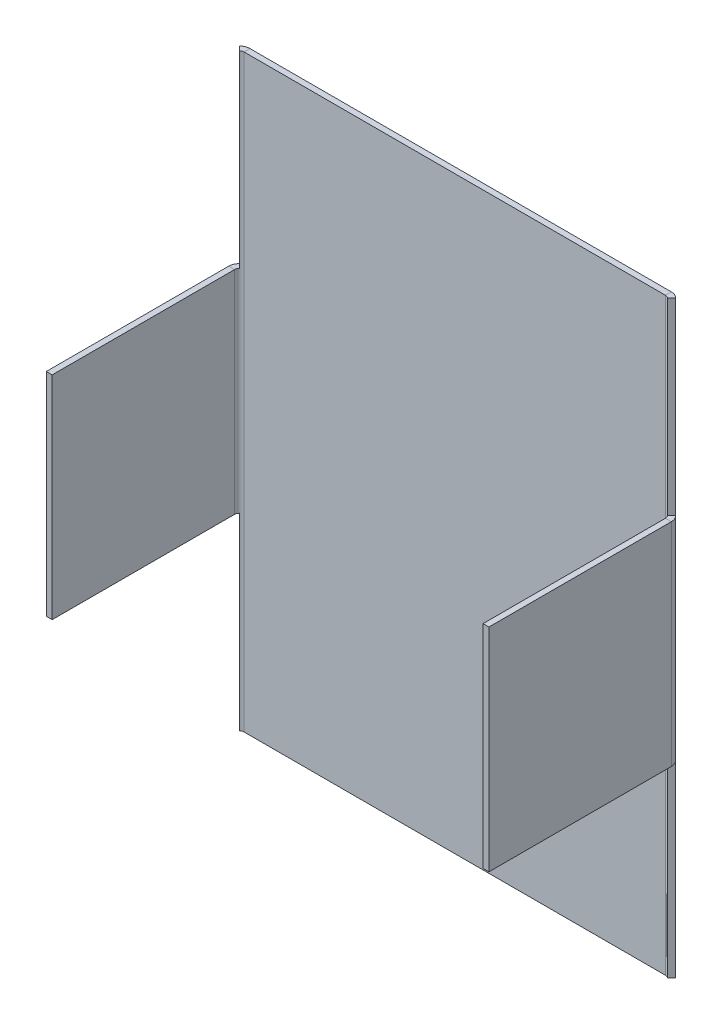
ISO-10303-21;
HEADER;
FILE_DESCRIPTION(('STEP AP214'),'2;1');
FILE_NAME('part.step','',(''),(''),'','','');
FILE_SCHEMA(('AUTOMOTIVE_DESIGN { 1 0 10303 214 1 1 1 1 }'));
ENDSEC;
DATA;
#1=APPLICATION_CONTEXT('core data for automotive mechanical design processes');
#2=APPLICATION_PROTOCOL_DEFINITION('international standard','automotive_design',2000,#1);
#3=PRODUCT_CONTEXT('',#1,'mechanical');
#4=PRODUCT('Part','Part','',(#3));
#5=PRODUCT_RELATED_PRODUCT_CATEGORY('part','',(#4));
#6=PRODUCT_DEFINITION_FORMATION('','',#4);
#7=PRODUCT_DEFINITION_CONTEXT('part definition',#1,'design');
#8=PRODUCT_DEFINITION('design','',#6,#7);
#9=PRODUCT_DEFINITION_SHAPE('','',#8);
#10=(LENGTH_UNIT() NAMED_UNIT(*) SI_UNIT(.MILLI.,.METRE.));
#11=(NAMED_UNIT(*) PLANE_ANGLE_UNIT() SI_UNIT($,.RADIAN.));
#12=(NAMED_UNIT(*) SI_UNIT($,.STERADIAN.) SOLID_ANGLE_UNIT());
#13=UNCERTAINTY_MEASURE_WITH_UNIT(LENGTH_MEASURE(1.E-05),#10,'distance_accuracy_value','');
#14=(GEOMETRIC_REPRESENTATION_CONTEXT(3) GLOBAL_UNCERTAINTY_ASSIGNED_CONTEXT((#13)) GLOBAL_UNIT_ASSIGNED_CONTEXT((#10,
#11,#12)) REPRESENTATION_CONTEXT('',''));
#15=CARTESIAN_POINT('',(0.,0.,0.));
#16=DIRECTION('',(0.,0.,1.));
#17=DIRECTION('',(1.,0.,0.));
#18=AXIS2_PLACEMENT_3D('',#15,#16,#17);
#19=CARTESIAN_POINT('',(-378.43533500819,-76.8636295973799,-3.175));
#20=DIRECTION('',(0.,-1.,0.));
#21=DIRECTION('',(0.,0.,-1.));
#22=AXIS2_PLACEMENT_3D('',#19,#20,#21);
#23=PLANE('',#22);
#24=DIRECTION('',(1.,0.,0.));
#25=VECTOR('',#24,1.);
#26=CARTESIAN_POINT('',(-378.43533500819,-76.8636295973799,-3.175));
#27=LINE('',#26,#25);
#28=CARTESIAN_POINT('',(-375.193604088767,-76.8636295973799,-3.175));
#29=VERTEX_POINT('',#28);
#30=CARTESIAN_POINT('',(-147.997065927613,-76.8636295973797,-3.175));
#31=VERTEX_POINT('',#30);
#32=EDGE_CURVE('E389',#29,#31,#27,.T.);
#33=ORIENTED_EDGE('',*,*,#32,.T.);
#34=DIRECTION('',(0.,0.,1.));
#35=VECTOR('',#34,1.);
#36=CARTESIAN_POINT('',(-147.997065927613,-76.8636295973799,-3.175));
#37=LINE('',#36,#35);
#38=CARTESIAN_POINT('',(-147.997065927613,-76.8636295973799,0.));
#39=VERTEX_POINT('',#38);
#40=EDGE_CURVE('E12',#31,#39,#37,.T.);
#41=ORIENTED_EDGE('',*,*,#40,.T.);
#42=DIRECTION('',(1.,0.,0.));
#43=VECTOR('',#42,1.);
#44=CARTESIAN_POINT('',(-378.43533500819,-76.8636295973799,0.));
#45=LINE('',#44,#43);
#46=CARTESIAN_POINT('',(-375.193604088767,-76.8636295973799,0.));
#47=VERTEX_POINT('',#46);
#48=EDGE_CURVE('E365',#47,#39,#45,.T.);
#49=ORIENTED_EDGE('',*,*,#48,.F.);
#50=DIRECTION('',(0.,0.,1.));
#51=VECTOR('',#50,1.);
#52=CARTESIAN_POINT('',(-375.193604088767,-76.8636295973799,-3.175));
#53=LINE('',#52,#51);
#54=EDGE_CURVE('E371',#29,#47,#53,.T.);
#55=ORIENTED_EDGE('',*,*,#54,.F.);
#56=EDGE_LOOP('',(#33,#41,#49,#55));
#57=FACE_BOUND('',#56,.T.);
#58=ADVANCED_FACE('F52',(#57),#23,.T.);
#59=CARTESIAN_POINT('',(-144.75533500819,240.63637040262,-3.175));
#60=DIRECTION('',(0.,1.,0.));
#61=DIRECTION('',(-1.,0.,0.));
#62=AXIS2_PLACEMENT_3D('',#59,#60,#61);
#63=PLANE('',#62);
#64=DIRECTION('',(-1.,0.,0.));
#65=VECTOR('',#64,1.);
#66=CARTESIAN_POINT('',(-144.75533500819,240.63637040262,0.));
#67=LINE('',#66,#65);
#68=CARTESIAN_POINT('',(-147.997065927613,240.63637040262,0.));
#69=VERTEX_POINT('',#68);
#70=CARTESIAN_POINT('',(-375.193604088767,240.63637040262,0.));
#71=VERTEX_POINT('',#70);
#72=EDGE_CURVE('E56',#69,#71,#67,.T.);
#73=ORIENTED_EDGE('',*,*,#72,.F.);
#74=DIRECTION('',(0.,0.,-1.));
#75=VECTOR('',#74,1.);
#76=CARTESIAN_POINT('',(-147.997065927613,240.63637040262,-3.175));
#77=LINE('',#76,#75);
#78=CARTESIAN_POINT('',(-147.997065927613,240.63637040262,-3.175));
#79=VERTEX_POINT('',#78);
#80=EDGE_CURVE('E385',#69,#79,#77,.T.);
#81=ORIENTED_EDGE('',*,*,#80,.T.);
#82=DIRECTION('',(-1.,0.,0.));
#83=VECTOR('',#82,1.);
#84=CARTESIAN_POINT('',(-144.75533500819,240.63637040262,-3.175));
#85=LINE('',#84,#83);
#86=CARTESIAN_POINT('',(-375.193604088767,240.63637040262,-3.175));
#87=VERTEX_POINT('',#86);
#88=EDGE_CURVE('E372',#79,#87,#85,.T.);
#89=ORIENTED_EDGE('',*,*,#88,.T.);
#90=DIRECTION('',(0.,0.,-1.));
#91=VECTOR('',#90,1.);
#92=CARTESIAN_POINT('',(-375.193604088767,240.63637040262,-3.175));
#93=LINE('',#92,#91);
#94=EDGE_CURVE('E379',#71,#87,#93,.T.);
#95=ORIENTED_EDGE('',*,*,#94,.F.);
#96=EDGE_LOOP('',(#73,#81,#89,#95));
#97=FACE_BOUND('',#96,.T.);
#98=ADVANCED_FACE('F490',(#97),#63,.T.);
#99=CARTESIAN_POINT('',(0.,0.,-3.175));
#100=DIRECTION('',(0.,0.,-1.));
#101=DIRECTION('',(-1.,0.,0.));
#102=AXIS2_PLACEMENT_3D('',#99,#100,#101);
#103=PLANE('',#102);
#104=ORIENTED_EDGE('',*,*,#88,.F.);
#105=DIRECTION('',(0.,-1.,0.));
#106=VECTOR('',#105,1.);
#107=CARTESIAN_POINT('',(-147.997065927613,0.,-3.175));
#108=LINE('',#107,#106);
#109=EDGE_CURVE('E382',#79,#31,#108,.T.);
#110=ORIENTED_EDGE('',*,*,#109,.T.);
#111=ORIENTED_EDGE('',*,*,#32,.F.);
#112=DIRECTION('',(0.,-1.,0.));
#113=VECTOR('',#112,1.);
#114=CARTESIAN_POINT('',(-375.193604088767,-1.96794603756588E-13,-3.175));
#115=LINE('',#114,#113);
#116=EDGE_CURVE('E367',#87,#29,#115,.T.);
#117=ORIENTED_EDGE('',*,*,#116,.F.);
#118=EDGE_LOOP('',(#104,#110,#111,#117));
#119=FACE_BOUND('',#118,.T.);
#120=ADVANCED_FACE('F450',(#119),#103,.T.);
#121=CARTESIAN_POINT('',(0.,0.,0.));
#122=DIRECTION('',(0.,0.,-1.));
#123=DIRECTION('',(-1.,0.,0.));
#124=AXIS2_PLACEMENT_3D('',#121,#122,#123);
#125=PLANE('',#124);
#126=DIRECTION('',(0.,-1.,0.));
#127=VECTOR('',#126,1.);
#128=CARTESIAN_POINT('',(-147.997065927613,0.,0.));
#129=LINE('',#128,#127);
#130=EDGE_CURVE('E61',#69,#39,#129,.T.);
#131=ORIENTED_EDGE('',*,*,#130,.F.);
#132=ORIENTED_EDGE('',*,*,#72,.T.);
#133=DIRECTION('',(0.,-1.,0.));
#134=VECTOR('',#133,1.);
#135=CARTESIAN_POINT('',(-375.193604088767,-1.96794603756588E-13,0.));
#136=LINE('',#135,#134);
#137=EDGE_CURVE('E376',#71,#47,#136,.T.);
#138=ORIENTED_EDGE('',*,*,#137,.T.);
#139=ORIENTED_EDGE('',*,*,#48,.T.);
#140=EDGE_LOOP('',(#131,#132,#138,#139));
#141=FACE_BOUND('',#140,.T.);
#142=ADVANCED_FACE('F54',(#141),#125,.F.);
#143=CARTESIAN_POINT('',(-375.193604088767,139.03637040262,2.54));
#144=DIRECTION('',(0.,1.,0.));
#145=DIRECTION('',(0.,0.,1.));
#146=AXIS2_PLACEMENT_3D('',#143,#144,#145);
#147=PLANE('',#146);
#148=DIRECTION('',(-1.,0.,0.));
#149=VECTOR('',#148,1.);
#150=CARTESIAN_POINT('',(-380.908604088767,139.03637040262,2.54000000000004));
#151=LINE('',#150,#149);
#152=CARTESIAN_POINT('',(-377.733604088767,139.03637040262,2.54000000000004));
#153=VERTEX_POINT('',#152);
#154=CARTESIAN_POINT('',(-380.908604088767,139.03637040262,2.54000000000011));
#155=VERTEX_POINT('',#154);
#156=EDGE_CURVE('E286',#153,#155,#151,.T.);
#157=ORIENTED_EDGE('',*,*,#156,.F.);
#158=CARTESIAN_POINT('',(-375.193604088767,139.03637040262,2.54));
#159=DIRECTION('',(0.,1.,0.));
#160=DIRECTION('',(-1.,0.,0.));
#161=AXIS2_PLACEMENT_3D('',#158,#159,#160);
#162=CIRCLE('',#161,2.54);
#163=CARTESIAN_POINT('',(-376.989655312981,139.03637040262,0.743948775786153));
#164=VERTEX_POINT('',#163);
#165=EDGE_CURVE('E282',#153,#164,#162,.F.);
#166=ORIENTED_EDGE('',*,*,#165,.T.);
#167=DIRECTION('',(-0.707106781186552,0.,-0.707106781186543));
#168=VECTOR('',#167,1.);
#169=CARTESIAN_POINT('',(-379.234719343249,139.03637040262,-1.50111525448112));
#170=LINE('',#169,#168);
#171=CARTESIAN_POINT('',(-379.234719343249,139.03637040262,-1.50111525448112));
#172=VERTEX_POINT('',#171);
#173=EDGE_CURVE('E363',#164,#172,#170,.T.);
#174=ORIENTED_EDGE('',*,*,#173,.T.);
#175=CARTESIAN_POINT('',(-375.193604088767,139.03637040262,2.54));
#176=DIRECTION('',(0.,-1.,0.));
#177=DIRECTION('',(0.,0.,1.));
#178=AXIS2_PLACEMENT_3D('',#175,#176,#177);
#179=CIRCLE('',#178,5.71500000000001);
#180=EDGE_CURVE('E316',#155,#172,#179,.T.);
#181=ORIENTED_EDGE('',*,*,#180,.F.);
#182=EDGE_LOOP('',(#157,#166,#174,#181));
#183=FACE_BOUND('',#182,.T.);
#184=ADVANCED_FACE('F482',(#183),#147,.T.);
#185=CARTESIAN_POINT('',(-379.234719343248,189.83637040262,-1.50111525448116));
#186=DIRECTION('',(-0.707106781186554,0.,0.707106781186541));
#187=DIRECTION('',(0.,1.,0.));
#188=AXIS2_PLACEMENT_3D('',#185,#186,#187);
#189=PLANE('',#188);
#190=ORIENTED_EDGE('',*,*,#173,.F.);
#191=DIRECTION('',(0.,1.,0.));
#192=VECTOR('',#191,1.);
#193=CARTESIAN_POINT('',(-376.989655312981,-235.695691279736,0.743948775786153));
#194=LINE('',#193,#192);
#195=CARTESIAN_POINT('',(-376.989655312981,240.63637040262,0.743948775786153));
#196=VERTEX_POINT('',#195);
#197=EDGE_CURVE('E350',#164,#196,#194,.T.);
#198=ORIENTED_EDGE('',*,*,#197,.T.);
#199=DIRECTION('',(-0.707106781186534,0.,-0.707106781186561));
#200=VECTOR('',#199,1.);
#201=CARTESIAN_POINT('',(-379.234719343248,240.63637040262,-1.50111525448121));
#202=LINE('',#201,#200);
#203=CARTESIAN_POINT('',(-379.234719343248,240.63637040262,-1.50111525448121));
#204=VERTEX_POINT('',#203);
#205=EDGE_CURVE('E361',#196,#204,#202,.T.);
#206=ORIENTED_EDGE('',*,*,#205,.T.);
#207=DIRECTION('',(0.,1.,0.));
#208=VECTOR('',#207,1.);
#209=CARTESIAN_POINT('',(-379.234719343248,240.63637040262,-1.50111525448121));
#210=LINE('',#209,#208);
#211=EDGE_CURVE('E319',#172,#204,#210,.T.);
#212=ORIENTED_EDGE('',*,*,#211,.F.);
#213=EDGE_LOOP('',(#190,#198,#206,#212));
#214=FACE_BOUND('',#213,.T.);
#215=ADVANCED_FACE('F485',(#214),#189,.T.);
#216=CARTESIAN_POINT('',(-375.193604088767,240.63637040262,2.54));
#217=DIRECTION('',(0.,1.,0.));
#218=DIRECTION('',(0.,0.,1.));
#219=AXIS2_PLACEMENT_3D('',#216,#217,#218);
#220=PLANE('',#219);
#221=ORIENTED_EDGE('',*,*,#205,.F.);
#222=CARTESIAN_POINT('',(-375.193604088767,240.63637040262,2.54));
#223=DIRECTION('',(0.,1.,0.));
#224=DIRECTION('',(-1.,0.,0.));
#225=AXIS2_PLACEMENT_3D('',#222,#223,#224);
#226=CIRCLE('',#225,2.54);
#227=EDGE_CURVE('E347',#196,#71,#226,.F.);
#228=ORIENTED_EDGE('',*,*,#227,.T.);
#229=ORIENTED_EDGE('',*,*,#94,.T.);
#230=CARTESIAN_POINT('',(-375.193604088767,240.63637040262,2.54));
#231=DIRECTION('',(0.,-1.,0.));
#232=DIRECTION('',(0.,0.,1.));
#233=AXIS2_PLACEMENT_3D('',#230,#231,#232);
#234=CIRCLE('',#233,5.715);
#235=EDGE_CURVE('E324',#204,#87,#234,.T.);
#236=ORIENTED_EDGE('',*,*,#235,.F.);
#237=EDGE_LOOP('',(#221,#228,#229,#236));
#238=FACE_BOUND('',#237,.T.);
#239=ADVANCED_FACE('F488',(#238),#220,.T.);
#240=CARTESIAN_POINT('',(-375.193604088767,-76.8636295973799,2.54));
#241=DIRECTION('',(0.,-1.,0.));
#242=DIRECTION('',(0.,0.,-1.));
#243=AXIS2_PLACEMENT_3D('',#240,#241,#242);
#244=PLANE('',#243);
#245=ORIENTED_EDGE('',*,*,#54,.T.);
#246=CARTESIAN_POINT('',(-375.193604088767,-76.8636295973798,2.54));
#247=DIRECTION('',(0.,1.,0.));
#248=DIRECTION('',(-1.,0.,0.));
#249=AXIS2_PLACEMENT_3D('',#246,#247,#248);
#250=CIRCLE('',#249,2.54);
#251=CARTESIAN_POINT('',(-376.989655312981,-76.8636295973798,0.743948775786182));
#252=VERTEX_POINT('',#251);
#253=EDGE_CURVE('E343',#47,#252,#250,.T.);
#254=ORIENTED_EDGE('',*,*,#253,.T.);
#255=DIRECTION('',(-0.707106781186556,0.,-0.707106781186539));
#256=VECTOR('',#255,1.);
#257=CARTESIAN_POINT('',(-379.234719343248,-76.8636295973799,-1.50111525448107));
#258=LINE('',#257,#256);
#259=CARTESIAN_POINT('',(-379.234719343248,-76.8636295973799,-1.50111525448107));
#260=VERTEX_POINT('',#259);
#261=EDGE_CURVE('E358',#252,#260,#258,.T.);
#262=ORIENTED_EDGE('',*,*,#261,.T.);
#263=CARTESIAN_POINT('',(-375.193604088767,-76.8636295973799,2.54));
#264=DIRECTION('',(0.,1.,0.));
#265=DIRECTION('',(0.,0.,-1.));
#266=AXIS2_PLACEMENT_3D('',#263,#264,#265);
#267=CIRCLE('',#266,5.71500000000002);
#268=EDGE_CURVE('E327',#29,#260,#267,.T.);
#269=ORIENTED_EDGE('',*,*,#268,.F.);
#270=EDGE_LOOP('',(#245,#254,#262,#269));
#271=FACE_BOUND('',#270,.T.);
#272=ADVANCED_FACE('F460',(#271),#244,.T.);
#273=CARTESIAN_POINT('',(-379.234719343248,-26.0636295973799,-1.50111525448109));
#274=DIRECTION('',(-0.707106781186543,0.,0.707106781186552));
#275=DIRECTION('',(0.,1.,0.));
#276=AXIS2_PLACEMENT_3D('',#273,#274,#275);
#277=PLANE('',#276);
#278=ORIENTED_EDGE('',*,*,#261,.F.);
#279=DIRECTION('',(0.,1.,0.));
#280=VECTOR('',#279,1.);
#281=CARTESIAN_POINT('',(-376.989655312981,-235.695691279736,0.743948775786182));
#282=LINE('',#281,#280);
#283=CARTESIAN_POINT('',(-376.989655312981,24.7363704026201,0.743948775786182));
#284=VERTEX_POINT('',#283);
#285=EDGE_CURVE('E339',#252,#284,#282,.T.);
#286=ORIENTED_EDGE('',*,*,#285,.T.);
#287=DIRECTION('',(-0.707106781186551,0.,-0.707106781186544));
#288=VECTOR('',#287,1.);
#289=CARTESIAN_POINT('',(-379.234719343248,24.7363704026201,-1.50111525448107));
#290=LINE('',#289,#288);
#291=CARTESIAN_POINT('',(-379.234719343248,24.7363704026201,-1.50111525448107));
#292=VERTEX_POINT('',#291);
#293=EDGE_CURVE('E338',#284,#292,#290,.T.);
#294=ORIENTED_EDGE('',*,*,#293,.T.);
#295=DIRECTION('',(0.,1.,0.));
#296=VECTOR('',#295,1.);
#297=CARTESIAN_POINT('',(-379.234719343248,24.7363704026201,-1.50111525448107));
#298=LINE('',#297,#296);
#299=EDGE_CURVE('E331',#260,#292,#298,.T.);
#300=ORIENTED_EDGE('',*,*,#299,.F.);
#301=EDGE_LOOP('',(#278,#286,#294,#300));
#302=FACE_BOUND('',#301,.T.);
#303=ADVANCED_FACE('F463',(#302),#277,.T.);
#304=CARTESIAN_POINT('',(-375.193604088767,24.7363704026201,2.54));
#305=DIRECTION('',(0.,-1.,0.));
#306=DIRECTION('',(1.,0.,0.));
#307=AXIS2_PLACEMENT_3D('',#304,#305,#306);
#308=PLANE('',#307);
#309=CARTESIAN_POINT('',(-375.193604088767,24.7363704026201,2.54));
#310=DIRECTION('',(0.,1.,0.));
#311=DIRECTION('',(-1.,0.,0.));
#312=AXIS2_PLACEMENT_3D('',#309,#310,#311);
#313=CIRCLE('',#312,2.54);
#314=CARTESIAN_POINT('',(-377.733604088767,24.7363704026201,2.5400000000001));
#315=VERTEX_POINT('',#314);
#316=EDGE_CURVE('E320',#284,#315,#313,.T.);
#317=ORIENTED_EDGE('',*,*,#316,.T.);
#318=DIRECTION('',(1.,0.,0.));
#319=VECTOR('',#318,1.);
#320=CARTESIAN_POINT('',(-380.908604088767,24.7363704026201,2.54000000000004));
#321=LINE('',#320,#319);
#322=CARTESIAN_POINT('',(-380.908604088767,24.7363704026201,2.54000000000004));
#323=VERTEX_POINT('',#322);
#324=EDGE_CURVE('E298',#323,#315,#321,.T.);
#325=ORIENTED_EDGE('',*,*,#324,.F.);
#326=CARTESIAN_POINT('',(-375.193604088767,24.7363704026201,2.54));
#327=DIRECTION('',(0.,1.,0.));
#328=DIRECTION('',(1.,0.,0.));
#329=AXIS2_PLACEMENT_3D('',#326,#327,#328);
#330=CIRCLE('',#329,5.71500000000001);
#331=EDGE_CURVE('E335',#292,#323,#330,.T.);
#332=ORIENTED_EDGE('',*,*,#331,.F.);
#333=ORIENTED_EDGE('',*,*,#293,.F.);
#334=EDGE_LOOP('',(#317,#325,#332,#333));
#335=FACE_BOUND('',#334,.T.);
#336=ADVANCED_FACE('F472',(#335),#308,.T.);
#337=CARTESIAN_POINT('',(-375.193604088767,-235.695691279736,2.54));
#338=DIRECTION('',(0.,1.,0.));
#339=DIRECTION('',(-1.,0.,0.));
#340=AXIS2_PLACEMENT_3D('',#337,#338,#339);
#341=CYLINDRICAL_SURFACE('',#340,5.715);
#342=ORIENTED_EDGE('',*,*,#299,.T.);
#343=ORIENTED_EDGE('',*,*,#331,.T.);
#344=DIRECTION('',(0.,-1.,0.));
#345=VECTOR('',#344,1.);
#346=CARTESIAN_POINT('',(-380.908604088767,-1.81125084176551E-13,2.54000000000004));
#347=LINE('',#346,#345);
#348=EDGE_CURVE('E305',#155,#323,#347,.T.);
#349=ORIENTED_EDGE('',*,*,#348,.F.);
#350=ORIENTED_EDGE('',*,*,#180,.T.);
#351=ORIENTED_EDGE('',*,*,#211,.T.);
#352=ORIENTED_EDGE('',*,*,#235,.T.);
#353=ORIENTED_EDGE('',*,*,#116,.T.);
#354=ORIENTED_EDGE('',*,*,#268,.T.);
#355=EDGE_LOOP('',(#342,#343,#349,#350,#351,#352,#353,#354));
#356=FACE_BOUND('',#355,.T.);
#357=ADVANCED_FACE('F457',(#356),#341,.T.);
#358=CARTESIAN_POINT('',(-375.193604088767,-235.695691279736,2.54));
#359=DIRECTION('',(0.,1.,0.));
#360=DIRECTION('',(-1.,0.,0.));
#361=AXIS2_PLACEMENT_3D('',#358,#359,#360);
#362=CYLINDRICAL_SURFACE('',#361,2.54);
#363=ORIENTED_EDGE('',*,*,#285,.F.);
#364=ORIENTED_EDGE('',*,*,#253,.F.);
#365=ORIENTED_EDGE('',*,*,#137,.F.);
#366=ORIENTED_EDGE('',*,*,#227,.F.);
#367=ORIENTED_EDGE('',*,*,#197,.F.);
#368=ORIENTED_EDGE('',*,*,#165,.F.);
#369=DIRECTION('',(0.,-1.,0.));
#370=VECTOR('',#369,1.);
#371=CARTESIAN_POINT('',(-377.733604088767,-1.79459749639613E-13,2.54000000000004));
#372=LINE('',#371,#370);
#373=EDGE_CURVE('E277',#153,#315,#372,.T.);
#374=ORIENTED_EDGE('',*,*,#373,.T.);
#375=ORIENTED_EDGE('',*,*,#316,.F.);
#376=EDGE_LOOP('',(#363,#364,#365,#366,#367,#368,#374,#375));
#377=FACE_BOUND('',#376,.T.);
#378=ADVANCED_FACE('F466',(#377),#362,.F.);
#379=CARTESIAN_POINT('',(-380.908604088767,139.03637040262,100.898269080577));
#380=DIRECTION('',(0.,0.,1.));
#381=DIRECTION('',(1.,0.,0.));
#382=AXIS2_PLACEMENT_3D('',#379,#380,#381);
#383=PLANE('',#382);
#384=DIRECTION('',(0.,-1.,0.));
#385=VECTOR('',#384,1.);
#386=CARTESIAN_POINT('',(-377.733604088767,139.03637040262,100.898269080577));
#387=LINE('',#386,#385);
#388=CARTESIAN_POINT('',(-377.733604088767,139.03637040262,100.898269080577));
#389=VERTEX_POINT('',#388);
#390=CARTESIAN_POINT('',(-377.733604088767,24.7363704026201,100.898269080577));
#391=VERTEX_POINT('',#390);
#392=EDGE_CURVE('E291',#389,#391,#387,.T.);
#393=ORIENTED_EDGE('',*,*,#392,.F.);
#394=DIRECTION('',(1.,0.,0.));
#395=VECTOR('',#394,1.);
#396=CARTESIAN_POINT('',(-380.908604088767,139.03637040262,100.898269080577));
#397=LINE('',#396,#395);
#398=CARTESIAN_POINT('',(-380.908604088767,139.03637040262,100.898269080577));
#399=VERTEX_POINT('',#398);
#400=EDGE_CURVE('E279',#399,#389,#397,.T.);
#401=ORIENTED_EDGE('',*,*,#400,.F.);
#402=DIRECTION('',(0.,-1.,0.));
#403=VECTOR('',#402,1.);
#404=CARTESIAN_POINT('',(-380.908604088767,139.03637040262,100.898269080577));
#405=LINE('',#404,#403);
#406=CARTESIAN_POINT('',(-380.908604088767,24.7363704026201,100.898269080577));
#407=VERTEX_POINT('',#406);
#408=EDGE_CURVE('E310',#399,#407,#405,.T.);
#409=ORIENTED_EDGE('',*,*,#408,.T.);
#410=DIRECTION('',(1.,0.,0.));
#411=VECTOR('',#410,1.);
#412=CARTESIAN_POINT('',(-380.908604088767,24.7363704026201,100.898269080577));
#413=LINE('',#412,#411);
#414=EDGE_CURVE('E307',#407,#391,#413,.T.);
#415=ORIENTED_EDGE('',*,*,#414,.T.);
#416=EDGE_LOOP('',(#393,#401,#409,#415));
#417=FACE_BOUND('',#416,.T.);
#418=ADVANCED_FACE('F518',(#417),#383,.T.);
#419=CARTESIAN_POINT('',(-380.908604088769,-1.9595436384634E-13,-379.137065927613));
#420=DIRECTION('',(-1.,0.,0.));
#421=DIRECTION('',(0.,0.,1.));
#422=AXIS2_PLACEMENT_3D('',#419,#420,#421);
#423=PLANE('',#422);
#424=DIRECTION('',(0.,0.,1.));
#425=VECTOR('',#424,1.);
#426=CARTESIAN_POINT('',(-380.908604088767,139.03637040262,-0.701730919422938));
#427=LINE('',#426,#425);
#428=EDGE_CURVE('E283',#155,#399,#427,.T.);
#429=ORIENTED_EDGE('',*,*,#428,.F.);
#430=ORIENTED_EDGE('',*,*,#348,.T.);
#431=DIRECTION('',(0.,0.,-1.));
#432=VECTOR('',#431,1.);
#433=CARTESIAN_POINT('',(-380.908604088767,24.7363704026201,100.898269080577));
#434=LINE('',#433,#432);
#435=EDGE_CURVE('E301',#407,#323,#434,.T.);
#436=ORIENTED_EDGE('',*,*,#435,.F.);
#437=ORIENTED_EDGE('',*,*,#408,.F.);
#438=EDGE_LOOP('',(#429,#430,#436,#437));
#439=FACE_BOUND('',#438,.T.);
#440=ADVANCED_FACE('F532',(#439),#423,.T.);
#441=CARTESIAN_POINT('',(-380.908604088767,24.7363704026201,100.898269080577));
#442=DIRECTION('',(0.,-1.,0.));
#443=DIRECTION('',(0.,0.,-1.));
#444=AXIS2_PLACEMENT_3D('',#441,#442,#443);
#445=PLANE('',#444);
#446=ORIENTED_EDGE('',*,*,#435,.T.);
#447=ORIENTED_EDGE('',*,*,#324,.T.);
#448=DIRECTION('',(0.,0.,-1.));
#449=VECTOR('',#448,1.);
#450=CARTESIAN_POINT('',(-377.733604088767,24.7363704026201,100.898269080577));
#451=LINE('',#450,#449);
#452=EDGE_CURVE('E288',#391,#315,#451,.T.);
#453=ORIENTED_EDGE('',*,*,#452,.F.);
#454=ORIENTED_EDGE('',*,*,#414,.F.);
#455=EDGE_LOOP('',(#446,#447,#453,#454));
#456=FACE_BOUND('',#455,.T.);
#457=ADVANCED_FACE('F528',(#456),#445,.T.);
#458=CARTESIAN_POINT('',(-377.733604088769,-1.94289029309402E-13,-379.137065927613));
#459=DIRECTION('',(-1.,0.,0.));
#460=DIRECTION('',(0.,0.,1.));
#461=AXIS2_PLACEMENT_3D('',#458,#459,#460);
#462=PLANE('',#461);
#463=ORIENTED_EDGE('',*,*,#373,.F.);
#464=DIRECTION('',(0.,0.,1.));
#465=VECTOR('',#464,1.);
#466=CARTESIAN_POINT('',(-377.733604088767,139.03637040262,-0.701730919422938));
#467=LINE('',#466,#465);
#468=EDGE_CURVE('E295',#153,#389,#467,.T.);
#469=ORIENTED_EDGE('',*,*,#468,.T.);
#470=ORIENTED_EDGE('',*,*,#392,.T.);
#471=ORIENTED_EDGE('',*,*,#452,.T.);
#472=EDGE_LOOP('',(#463,#469,#470,#471));
#473=FACE_BOUND('',#472,.T.);
#474=ADVANCED_FACE('F524',(#473),#462,.F.);
#475=CARTESIAN_POINT('',(-380.908604088767,139.03637040262,-0.701730919422938));
#476=DIRECTION('',(0.,1.,0.));
#477=DIRECTION('',(1.,0.,0.));
#478=AXIS2_PLACEMENT_3D('',#475,#476,#477);
#479=PLANE('',#478);
#480=ORIENTED_EDGE('',*,*,#468,.F.);
#481=ORIENTED_EDGE('',*,*,#156,.T.);
#482=ORIENTED_EDGE('',*,*,#428,.T.);
#483=ORIENTED_EDGE('',*,*,#400,.T.);
#484=EDGE_LOOP('',(#480,#481,#482,#483));
#485=FACE_BOUND('',#484,.T.);
#486=ADVANCED_FACE('F521',(#485),#479,.T.);
#487=CARTESIAN_POINT('',(-147.997065927613,240.63637040262,2.54));
#488=DIRECTION('',(0.,1.,0.));
#489=DIRECTION('',(0.,0.,1.));
#490=AXIS2_PLACEMENT_3D('',#487,#488,#489);
#491=PLANE('',#490);
#492=ORIENTED_EDGE('',*,*,#80,.F.);
#493=CARTESIAN_POINT('',(-147.997065927613,240.63637040262,2.54));
#494=DIRECTION('',(0.,-1.,0.));
#495=DIRECTION('',(0.,0.,-1.));
#496=AXIS2_PLACEMENT_3D('',#493,#494,#495);
#497=CIRCLE('',#496,2.54);
#498=CARTESIAN_POINT('',(-146.201014703399,240.63637040262,0.743948775786154));
#499=VERTEX_POINT('',#498);
#500=EDGE_CURVE('E217',#69,#499,#497,.T.);
#501=ORIENTED_EDGE('',*,*,#500,.T.);
#502=DIRECTION('',(0.707106781186532,0.,-0.707106781186563));
#503=VECTOR('',#502,1.);
#504=CARTESIAN_POINT('',(-143.955950673132,240.63637040262,-1.50111525448121));
#505=LINE('',#504,#503);
#506=CARTESIAN_POINT('',(-143.955950673132,240.63637040262,-1.50111525448121));
#507=VERTEX_POINT('',#506);
#508=EDGE_CURVE('E275',#499,#507,#505,.T.);
#509=ORIENTED_EDGE('',*,*,#508,.T.);
#510=CARTESIAN_POINT('',(-147.997065927613,240.63637040262,2.54));
#511=DIRECTION('',(0.,-1.,0.));
#512=DIRECTION('',(0.,0.,1.));
#513=AXIS2_PLACEMENT_3D('',#510,#511,#512);
#514=CIRCLE('',#513,5.715);
#515=EDGE_CURVE('E237',#79,#507,#514,.T.);
#516=ORIENTED_EDGE('',*,*,#515,.F.);
#517=EDGE_LOOP('',(#492,#501,#509,#516));
#518=FACE_BOUND('',#517,.T.);
#519=ADVANCED_FACE('F492',(#518),#491,.T.);
#520=CARTESIAN_POINT('',(-143.955950673132,189.83637040262,-1.50111525448116));
#521=DIRECTION('',(0.707106781186554,0.,0.707106781186541));
#522=DIRECTION('',(0.,-1.,0.));
#523=AXIS2_PLACEMENT_3D('',#520,#521,#522);
#524=PLANE('',#523);
#525=ORIENTED_EDGE('',*,*,#508,.F.);
#526=DIRECTION('',(0.,-1.,0.));
#527=VECTOR('',#526,1.);
#528=CARTESIAN_POINT('',(-146.201014703399,399.468432084976,0.743948775786154));
#529=LINE('',#528,#527);
#530=CARTESIAN_POINT('',(-146.201014703399,139.03637040262,0.743948775786154));
#531=VERTEX_POINT('',#530);
#532=EDGE_CURVE('E265',#499,#531,#529,.T.);
#533=ORIENTED_EDGE('',*,*,#532,.T.);
#534=DIRECTION('',(0.707106781186551,0.,-0.707106781186544));
#535=VECTOR('',#534,1.);
#536=CARTESIAN_POINT('',(-143.955950673132,139.03637040262,-1.5011152544811));
#537=LINE('',#536,#535);
#538=CARTESIAN_POINT('',(-143.955950673132,139.03637040262,-1.5011152544811));
#539=VERTEX_POINT('',#538);
#540=EDGE_CURVE('E273',#531,#539,#537,.T.);
#541=ORIENTED_EDGE('',*,*,#540,.T.);
#542=DIRECTION('',(0.,-1.,0.));
#543=VECTOR('',#542,1.);
#544=CARTESIAN_POINT('',(-143.955950673132,139.03637040262,-1.5011152544811));
#545=LINE('',#544,#543);
#546=EDGE_CURVE('E240',#507,#539,#545,.T.);
#547=ORIENTED_EDGE('',*,*,#546,.F.);
#548=EDGE_LOOP('',(#525,#533,#541,#547));
#549=FACE_BOUND('',#548,.T.);
#550=ADVANCED_FACE('F433',(#549),#524,.T.);
#551=CARTESIAN_POINT('',(-147.997065927613,139.03637040262,2.54));
#552=DIRECTION('',(0.,1.,0.));
#553=DIRECTION('',(0.,0.,1.));
#554=AXIS2_PLACEMENT_3D('',#551,#552,#553);
#555=PLANE('',#554);
#556=ORIENTED_EDGE('',*,*,#540,.F.);
#557=CARTESIAN_POINT('',(-147.997065927613,139.03637040262,2.54));
#558=DIRECTION('',(0.,-1.,0.));
#559=DIRECTION('',(0.,0.,-1.));
#560=AXIS2_PLACEMENT_3D('',#557,#558,#559);
#561=CIRCLE('',#560,2.54);
#562=CARTESIAN_POINT('',(-145.457065927613,139.03637040262,2.54000000000001));
#563=VERTEX_POINT('',#562);
#564=EDGE_CURVE('E262',#531,#563,#561,.T.);
#565=ORIENTED_EDGE('',*,*,#564,.T.);
#566=DIRECTION('',(1.,0.,0.));
#567=VECTOR('',#566,1.);
#568=CARTESIAN_POINT('',(-142.282065927613,139.03637040262,2.54000000000001));
#569=LINE('',#568,#567);
#570=CARTESIAN_POINT('',(-142.282065927613,139.03637040262,2.54000000000001));
#571=VERTEX_POINT('',#570);
#572=EDGE_CURVE('E225',#563,#571,#569,.T.);
#573=ORIENTED_EDGE('',*,*,#572,.T.);
#574=CARTESIAN_POINT('',(-147.997065927613,139.03637040262,2.54));
#575=DIRECTION('',(0.,-1.,0.));
#576=DIRECTION('',(0.,0.,1.));
#577=AXIS2_PLACEMENT_3D('',#574,#575,#576);
#578=CIRCLE('',#577,5.715);
#579=EDGE_CURVE('E243',#539,#571,#578,.T.);
#580=ORIENTED_EDGE('',*,*,#579,.F.);
#581=EDGE_LOOP('',(#556,#565,#573,#580));
#582=FACE_BOUND('',#581,.T.);
#583=ADVANCED_FACE('F425',(#582),#555,.T.);
#584=CARTESIAN_POINT('',(-147.997065927613,24.7363704026201,2.54));
#585=DIRECTION('',(0.,-1.,0.));
#586=DIRECTION('',(0.,0.,-1.));
#587=AXIS2_PLACEMENT_3D('',#584,#585,#586);
#588=PLANE('',#587);
#589=DIRECTION('',(-1.,0.,0.));
#590=VECTOR('',#589,1.);
#591=CARTESIAN_POINT('',(-142.282065927613,24.7363704026201,2.54000000000001));
#592=LINE('',#591,#590);
#593=CARTESIAN_POINT('',(-142.282065927613,24.7363704026201,2.54000000000003));
#594=VERTEX_POINT('',#593);
#595=CARTESIAN_POINT('',(-145.457065927613,24.7363704026201,2.54000000000001));
#596=VERTEX_POINT('',#595);
#597=EDGE_CURVE('E206',#594,#596,#592,.T.);
#598=ORIENTED_EDGE('',*,*,#597,.T.);
#599=CARTESIAN_POINT('',(-147.997065927613,24.7363704026201,2.54));
#600=DIRECTION('',(0.,-1.,0.));
#601=DIRECTION('',(0.,0.,-1.));
#602=AXIS2_PLACEMENT_3D('',#599,#600,#601);
#603=CIRCLE('',#602,2.54);
#604=CARTESIAN_POINT('',(-146.201014703399,24.7363704026201,0.743948775786178));
#605=VERTEX_POINT('',#604);
#606=EDGE_CURVE('E259',#596,#605,#603,.F.);
#607=ORIENTED_EDGE('',*,*,#606,.T.);
#608=DIRECTION('',(0.707106781186551,0.,-0.707106781186543));
#609=VECTOR('',#608,1.);
#610=CARTESIAN_POINT('',(-143.955950673132,24.7363704026201,-1.5011152544811));
#611=LINE('',#610,#609);
#612=CARTESIAN_POINT('',(-143.955950673132,24.7363704026201,-1.5011152544811));
#613=VERTEX_POINT('',#612);
#614=EDGE_CURVE('E271',#605,#613,#611,.T.);
#615=ORIENTED_EDGE('',*,*,#614,.T.);
#616=CARTESIAN_POINT('',(-147.997065927613,24.7363704026201,2.54));
#617=DIRECTION('',(0.,1.,0.));
#618=DIRECTION('',(0.,0.,-1.));
#619=AXIS2_PLACEMENT_3D('',#616,#617,#618);
#620=CIRCLE('',#619,5.715);
#621=EDGE_CURVE('E246',#594,#613,#620,.T.);
#622=ORIENTED_EDGE('',*,*,#621,.F.);
#623=EDGE_LOOP('',(#598,#607,#615,#622));
#624=FACE_BOUND('',#623,.T.);
#625=ADVANCED_FACE('F442',(#624),#588,.T.);
#626=CARTESIAN_POINT('',(-143.955950673132,-26.0636295973799,-1.5011152544811));
#627=DIRECTION('',(0.707106781186544,0.,0.707106781186551));
#628=DIRECTION('',(0.,-1.,0.));
#629=AXIS2_PLACEMENT_3D('',#626,#627,#628);
#630=PLANE('',#629);
#631=ORIENTED_EDGE('',*,*,#614,.F.);
#632=DIRECTION('',(0.,-1.,0.));
#633=VECTOR('',#632,1.);
#634=CARTESIAN_POINT('',(-146.201014703399,399.468432084976,0.743948775786178));
#635=LINE('',#634,#633);
#636=CARTESIAN_POINT('',(-146.201014703399,-76.8636295973799,0.743948775786178));
#637=VERTEX_POINT('',#636);
#638=EDGE_CURVE('E256',#605,#637,#635,.T.);
#639=ORIENTED_EDGE('',*,*,#638,.T.);
#640=DIRECTION('',(0.707106781186551,0.,-0.707106781186544));
#641=VECTOR('',#640,1.);
#642=CARTESIAN_POINT('',(-143.955950673132,-76.8636295973799,-1.5011152544811));
#643=LINE('',#642,#641);
#644=CARTESIAN_POINT('',(-143.955950673132,-76.8636295973799,-1.5011152544811));
#645=VERTEX_POINT('',#644);
#646=EDGE_CURVE('E255',#637,#645,#643,.T.);
#647=ORIENTED_EDGE('',*,*,#646,.T.);
#648=DIRECTION('',(0.,-1.,0.));
#649=VECTOR('',#648,1.);
#650=CARTESIAN_POINT('',(-143.955950673132,-76.8636295973799,-1.5011152544811));
#651=LINE('',#650,#649);
#652=EDGE_CURVE('E249',#613,#645,#651,.T.);
#653=ORIENTED_EDGE('',*,*,#652,.F.);
#654=EDGE_LOOP('',(#631,#639,#647,#653));
#655=FACE_BOUND('',#654,.T.);
#656=ADVANCED_FACE('F446',(#655),#630,.T.);
#657=CARTESIAN_POINT('',(-147.997065927613,-76.8636295973799,2.54));
#658=DIRECTION('',(0.,-1.,0.));
#659=DIRECTION('',(0.,0.,-1.));
#660=AXIS2_PLACEMENT_3D('',#657,#658,#659);
#661=PLANE('',#660);
#662=CARTESIAN_POINT('',(-147.997065927613,-76.8636295973799,2.54));
#663=DIRECTION('',(0.,-1.,0.));
#664=DIRECTION('',(0.,0.,-1.));
#665=AXIS2_PLACEMENT_3D('',#662,#663,#664);
#666=CIRCLE('',#665,2.54);
#667=EDGE_CURVE('E69',#637,#39,#666,.F.);
#668=ORIENTED_EDGE('',*,*,#667,.T.);
#669=ORIENTED_EDGE('',*,*,#40,.F.);
#670=CARTESIAN_POINT('',(-147.997065927613,-76.8636295973799,2.54));
#671=DIRECTION('',(0.,1.,0.));
#672=DIRECTION('',(0.,0.,-1.));
#673=AXIS2_PLACEMENT_3D('',#670,#671,#672);
#674=CIRCLE('',#673,5.715);
#675=EDGE_CURVE('E252',#645,#31,#674,.T.);
#676=ORIENTED_EDGE('',*,*,#675,.F.);
#677=ORIENTED_EDGE('',*,*,#646,.F.);
#678=EDGE_LOOP('',(#668,#669,#676,#677));
#679=FACE_BOUND('',#678,.T.);
#680=ADVANCED_FACE('F447',(#679),#661,.T.);
#681=CARTESIAN_POINT('',(-147.997065927613,399.468432084976,2.54));
#682=DIRECTION('',(0.,-1.,0.));
#683=DIRECTION('',(0.,0.,-1.));
#684=AXIS2_PLACEMENT_3D('',#681,#682,#683);
#685=CYLINDRICAL_SURFACE('',#684,5.715);
#686=ORIENTED_EDGE('',*,*,#652,.T.);
#687=ORIENTED_EDGE('',*,*,#675,.T.);
#688=ORIENTED_EDGE('',*,*,#109,.F.);
#689=ORIENTED_EDGE('',*,*,#515,.T.);
#690=ORIENTED_EDGE('',*,*,#546,.T.);
#691=ORIENTED_EDGE('',*,*,#579,.T.);
#692=DIRECTION('',(0.,-1.,0.));
#693=VECTOR('',#692,1.);
#694=CARTESIAN_POINT('',(-142.282065927613,0.,2.54000000000001));
#695=LINE('',#694,#693);
#696=EDGE_CURVE('E235',#571,#594,#695,.T.);
#697=ORIENTED_EDGE('',*,*,#696,.T.);
#698=ORIENTED_EDGE('',*,*,#621,.T.);
#699=EDGE_LOOP('',(#686,#687,#688,#689,#690,#691,#697,#698));
#700=FACE_BOUND('',#699,.T.);
#701=ADVANCED_FACE('F428',(#700),#685,.T.);
#702=CARTESIAN_POINT('',(-147.997065927613,399.468432084976,2.54));
#703=DIRECTION('',(0.,-1.,0.));
#704=DIRECTION('',(0.,0.,-1.));
#705=AXIS2_PLACEMENT_3D('',#702,#703,#704);
#706=CYLINDRICAL_SURFACE('',#705,2.54);
#707=ORIENTED_EDGE('',*,*,#638,.F.);
#708=ORIENTED_EDGE('',*,*,#606,.F.);
#709=DIRECTION('',(0.,-1.,0.));
#710=VECTOR('',#709,1.);
#711=CARTESIAN_POINT('',(-145.457065927613,0.,2.54000000000001));
#712=LINE('',#711,#710);
#713=EDGE_CURVE('E411',#563,#596,#712,.T.);
#714=ORIENTED_EDGE('',*,*,#713,.F.);
#715=ORIENTED_EDGE('',*,*,#564,.F.);
#716=ORIENTED_EDGE('',*,*,#532,.F.);
#717=ORIENTED_EDGE('',*,*,#500,.F.);
#718=ORIENTED_EDGE('',*,*,#130,.T.);
#719=ORIENTED_EDGE('',*,*,#667,.F.);
#720=EDGE_LOOP('',(#707,#708,#714,#715,#716,#717,#718,#719));
#721=FACE_BOUND('',#720,.T.);
#722=ADVANCED_FACE('F437',(#721),#706,.F.);
#723=CARTESIAN_POINT('',(-142.282065927614,24.7363704026201,100.898269080577));
#724=DIRECTION('',(0.,0.,1.));
#725=DIRECTION('',(0.,1.,0.));
#726=AXIS2_PLACEMENT_3D('',#723,#724,#725);
#727=PLANE('',#726);
#728=DIRECTION('',(0.,1.,0.));
#729=VECTOR('',#728,1.);
#730=CARTESIAN_POINT('',(-145.457065927614,24.7363704026201,100.898269080577));
#731=LINE('',#730,#729);
#732=CARTESIAN_POINT('',(-145.457065927614,24.7363704026201,100.898269080577));
#733=VERTEX_POINT('',#732);
#734=CARTESIAN_POINT('',(-145.457065927614,139.03637040262,100.898269080577));
#735=VERTEX_POINT('',#734);
#736=EDGE_CURVE('E210',#733,#735,#731,.T.);
#737=ORIENTED_EDGE('',*,*,#736,.F.);
#738=DIRECTION('',(-1.,0.,0.));
#739=VECTOR('',#738,1.);
#740=CARTESIAN_POINT('',(-142.282065927614,24.7363704026201,100.898269080577));
#741=LINE('',#740,#739);
#742=CARTESIAN_POINT('',(-142.282065927614,24.7363704026201,100.898269080577));
#743=VERTEX_POINT('',#742);
#744=EDGE_CURVE('E203',#743,#733,#741,.T.);
#745=ORIENTED_EDGE('',*,*,#744,.F.);
#746=DIRECTION('',(0.,1.,0.));
#747=VECTOR('',#746,1.);
#748=CARTESIAN_POINT('',(-142.282065927614,24.7363704026201,100.898269080577));
#749=LINE('',#748,#747);
#750=CARTESIAN_POINT('',(-142.282065927614,139.03637040262,100.898269080577));
#751=VERTEX_POINT('',#750);
#752=EDGE_CURVE('E215',#743,#751,#749,.T.);
#753=ORIENTED_EDGE('',*,*,#752,.T.);
#754=DIRECTION('',(-1.,0.,0.));
#755=VECTOR('',#754,1.);
#756=CARTESIAN_POINT('',(-142.282065927614,139.03637040262,100.898269080577));
#757=LINE('',#756,#755);
#758=EDGE_CURVE('E224',#751,#735,#757,.T.);
#759=ORIENTED_EDGE('',*,*,#758,.T.);
#760=EDGE_LOOP('',(#737,#745,#753,#759));
#761=FACE_BOUND('',#760,.T.);
#762=ADVANCED_FACE('F214',(#761),#727,.T.);
#763=CARTESIAN_POINT('',(-142.282065927614,0.,144.053604088767));
#764=DIRECTION('',(1.,0.,0.));
#765=DIRECTION('',(0.,0.,-1.));
#766=AXIS2_PLACEMENT_3D('',#763,#764,#765);
#767=PLANE('',#766);
#768=ORIENTED_EDGE('',*,*,#696,.F.);
#769=DIRECTION('',(0.,0.,-1.));
#770=VECTOR('',#769,1.);
#771=CARTESIAN_POINT('',(-142.282065927614,139.03637040262,100.898269080577));
#772=LINE('',#771,#770);
#773=EDGE_CURVE('E222',#751,#571,#772,.T.);
#774=ORIENTED_EDGE('',*,*,#773,.F.);
#775=ORIENTED_EDGE('',*,*,#752,.F.);
#776=DIRECTION('',(0.,0.,1.));
#777=VECTOR('',#776,1.);
#778=CARTESIAN_POINT('',(-142.282065927613,24.7363704026201,-0.701730919422966));
#779=LINE('',#778,#777);
#780=EDGE_CURVE('E200',#594,#743,#779,.T.);
#781=ORIENTED_EDGE('',*,*,#780,.F.);
#782=EDGE_LOOP('',(#768,#774,#775,#781));
#783=FACE_BOUND('',#782,.T.);
#784=ADVANCED_FACE('F220',(#783),#767,.T.);
#785=CARTESIAN_POINT('',(-142.282065927614,139.03637040262,100.898269080577));
#786=DIRECTION('',(0.,1.,0.));
#787=DIRECTION('',(-1.,0.,0.));
#788=AXIS2_PLACEMENT_3D('',#785,#786,#787);
#789=PLANE('',#788);
#790=ORIENTED_EDGE('',*,*,#572,.F.);
#791=DIRECTION('',(0.,0.,-1.));
#792=VECTOR('',#791,1.);
#793=CARTESIAN_POINT('',(-145.457065927614,139.03637040262,100.898269080577));
#794=LINE('',#793,#792);
#795=EDGE_CURVE('E416',#735,#563,#794,.T.);
#796=ORIENTED_EDGE('',*,*,#795,.F.);
#797=ORIENTED_EDGE('',*,*,#758,.F.);
#798=ORIENTED_EDGE('',*,*,#773,.T.);
#799=EDGE_LOOP('',(#790,#796,#797,#798));
#800=FACE_BOUND('',#799,.T.);
#801=ADVANCED_FACE('F420',(#800),#789,.T.);
#802=CARTESIAN_POINT('',(-145.457065927614,0.,144.053604088767));
#803=DIRECTION('',(1.,0.,0.));
#804=DIRECTION('',(0.,0.,-1.));
#805=AXIS2_PLACEMENT_3D('',#802,#803,#804);
#806=PLANE('',#805);
#807=ORIENTED_EDGE('',*,*,#795,.T.);
#808=ORIENTED_EDGE('',*,*,#713,.T.);
#809=DIRECTION('',(0.,0.,1.));
#810=VECTOR('',#809,1.);
#811=CARTESIAN_POINT('',(-145.457065927613,24.7363704026201,-0.701730919422966));
#812=LINE('',#811,#810);
#813=EDGE_CURVE('E408',#596,#733,#812,.T.);
#814=ORIENTED_EDGE('',*,*,#813,.T.);
#815=ORIENTED_EDGE('',*,*,#736,.T.);
#816=EDGE_LOOP('',(#807,#808,#814,#815));
#817=FACE_BOUND('',#816,.T.);
#818=ADVANCED_FACE('F440',(#817),#806,.F.);
#819=CARTESIAN_POINT('',(-142.282065927613,24.7363704026201,-0.701730919422966));
#820=DIRECTION('',(0.,-1.,0.));
#821=DIRECTION('',(0.,0.,1.));
#822=AXIS2_PLACEMENT_3D('',#819,#820,#821);
#823=PLANE('',#822);
#824=ORIENTED_EDGE('',*,*,#597,.F.);
#825=ORIENTED_EDGE('',*,*,#780,.T.);
#826=ORIENTED_EDGE('',*,*,#744,.T.);
#827=ORIENTED_EDGE('',*,*,#813,.F.);
#828=EDGE_LOOP('',(#824,#825,#826,#827));
#829=FACE_BOUND('',#828,.T.);
#830=ADVANCED_FACE('F202',(#829),#823,.T.);
#831=CLOSED_SHELL('',(#58,#98,#120,#142,#184,#215,#239,#272,#303,#336,#357,#378,#418,#440,#457,
#474,#486,#519,#550,#583,#625,#656,#680,#701,#722,#762,#784,#801,#818,#830));
#832=MANIFOLD_SOLID_BREP('B2',#831);
#833=ADVANCED_BREP_SHAPE_REPRESENTATION('',(#18,#832),#14);
#834=SHAPE_DEFINITION_REPRESENTATION(#9,#833);
ENDSEC;
END-ISO-10303-21;
